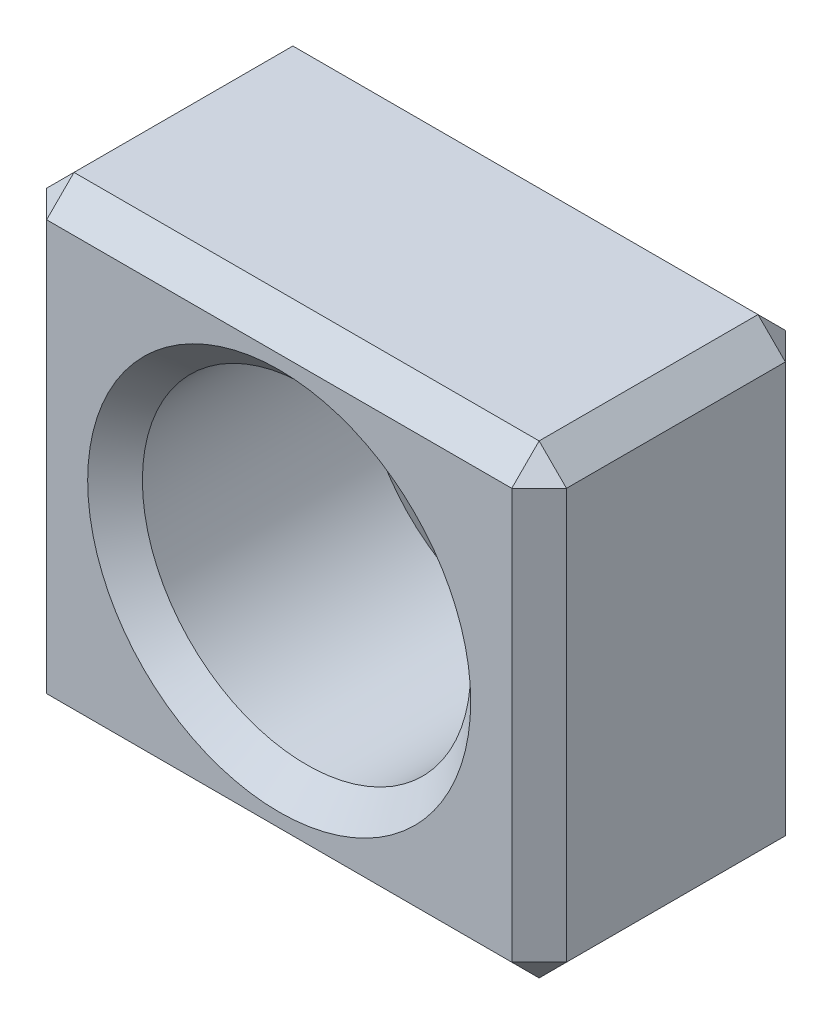
ISO-10303-21;
HEADER;
FILE_DESCRIPTION(('STEP AP214'),'2;1');
FILE_NAME('part.step','',(''),(''),'','','');
FILE_SCHEMA(('AUTOMOTIVE_DESIGN { 1 0 10303 214 1 1 1 1 }'));
ENDSEC;
DATA;
#1=APPLICATION_CONTEXT('core data for automotive mechanical design processes');
#2=APPLICATION_PROTOCOL_DEFINITION('international standard','automotive_design',2000,#1);
#3=PRODUCT_CONTEXT('',#1,'mechanical');
#4=PRODUCT('Part','Part','',(#3));
#5=PRODUCT_RELATED_PRODUCT_CATEGORY('part','',(#4));
#6=PRODUCT_DEFINITION_FORMATION('','',#4);
#7=PRODUCT_DEFINITION_CONTEXT('part definition',#1,'design');
#8=PRODUCT_DEFINITION('design','',#6,#7);
#9=PRODUCT_DEFINITION_SHAPE('','',#8);
#10=(LENGTH_UNIT() NAMED_UNIT(*) SI_UNIT(.MILLI.,.METRE.));
#11=(NAMED_UNIT(*) PLANE_ANGLE_UNIT() SI_UNIT($,.RADIAN.));
#12=(NAMED_UNIT(*) SI_UNIT($,.STERADIAN.) SOLID_ANGLE_UNIT());
#13=UNCERTAINTY_MEASURE_WITH_UNIT(LENGTH_MEASURE(1.E-05),#10,'distance_accuracy_value','');
#14=(GEOMETRIC_REPRESENTATION_CONTEXT(3) GLOBAL_UNCERTAINTY_ASSIGNED_CONTEXT((#13)) GLOBAL_UNIT_ASSIGNED_CONTEXT((#10,
#11,#12)) REPRESENTATION_CONTEXT('',''));
#15=CARTESIAN_POINT('',(0.,0.,0.));
#16=DIRECTION('',(0.,0.,1.));
#17=DIRECTION('',(1.,0.,0.));
#18=AXIS2_PLACEMENT_3D('',#15,#16,#17);
#19=CARTESIAN_POINT('',(8.5,7.5,10.));
#20=DIRECTION('',(-0.577350269189626,-0.577350269189626,-0.577350269189626));
#21=DIRECTION('',(0.,-0.707106781186548,0.707106781186548));
#22=AXIS2_PLACEMENT_3D('',#19,#20,#21);
#23=PLANE('',#22);
#24=DIRECTION('',(-0.707106781186548,0.707106781186548,0.));
#25=VECTOR('',#24,1.);
#26=CARTESIAN_POINT('',(9.,8.,9.));
#27=LINE('',#26,#25);
#28=CARTESIAN_POINT('',(9.5,7.5,9.));
#29=VERTEX_POINT('',#28);
#30=CARTESIAN_POINT('',(8.5,8.5,9.));
#31=VERTEX_POINT('',#30);
#32=EDGE_CURVE('E25',#29,#31,#27,.T.);
#33=ORIENTED_EDGE('',*,*,#32,.T.);
#34=DIRECTION('',(0.,0.707106781186548,-0.707106781186548));
#35=VECTOR('',#34,1.);
#36=CARTESIAN_POINT('',(8.5,7.75,9.75));
#37=LINE('',#36,#35);
#38=CARTESIAN_POINT('',(8.5,7.5,10.));
#39=VERTEX_POINT('',#38);
#40=EDGE_CURVE('E227',#39,#31,#37,.T.);
#41=ORIENTED_EDGE('',*,*,#40,.F.);
#42=DIRECTION('',(0.707106781186548,0.,-0.707106781186548));
#43=VECTOR('',#42,1.);
#44=CARTESIAN_POINT('',(8.75,7.5,9.75));
#45=LINE('',#44,#43);
#46=EDGE_CURVE('E204',#39,#29,#45,.T.);
#47=ORIENTED_EDGE('',*,*,#46,.T.);
#48=EDGE_LOOP('',(#33,#41,#47));
#49=FACE_BOUND('',#48,.T.);
#50=ADVANCED_FACE('F16',(#49),#23,.F.);
#51=CARTESIAN_POINT('',(0.,0.,0.));
#52=DIRECTION('',(0.,0.,-1.));
#53=DIRECTION('',(1.,0.,0.));
#54=AXIS2_PLACEMENT_3D('',#51,#52,#53);
#55=CYLINDRICAL_SURFACE('',#54,6.);
#56=DIRECTION('',(0.,0.,1.));
#57=VECTOR('',#56,1.);
#58=CARTESIAN_POINT('',(6.,0.,0.));
#59=LINE('',#58,#57);
#60=CARTESIAN_POINT('',(6.,0.,1.));
#61=VERTEX_POINT('',#60);
#62=CARTESIAN_POINT('',(6.,0.,9.));
#63=VERTEX_POINT('',#62);
#64=EDGE_CURVE('E10',#61,#63,#59,.T.);
#65=ORIENTED_EDGE('',*,*,#64,.F.);
#66=CARTESIAN_POINT('',(0.,0.,1.));
#67=DIRECTION('',(0.,0.,1.));
#68=DIRECTION('',(1.,0.,0.));
#69=AXIS2_PLACEMENT_3D('',#66,#67,#68);
#70=CIRCLE('',#69,6.);
#71=EDGE_CURVE('E221',#61,#61,#70,.T.);
#72=ORIENTED_EDGE('',*,*,#71,.F.);
#73=ORIENTED_EDGE('',*,*,#64,.T.);
#74=CARTESIAN_POINT('',(0.,0.,9.));
#75=DIRECTION('',(0.,0.,-1.));
#76=DIRECTION('',(1.,0.,0.));
#77=AXIS2_PLACEMENT_3D('',#74,#75,#76);
#78=CIRCLE('',#77,6.);
#79=EDGE_CURVE('E231',#63,#63,#78,.T.);
#80=ORIENTED_EDGE('',*,*,#79,.F.);
#81=EDGE_LOOP('',(#65,#72,#73,#80));
#82=FACE_BOUND('',#81,.T.);
#83=ADVANCED_FACE('F421',(#82),#55,.F.);
#84=CARTESIAN_POINT('',(8.5,7.5,0.));
#85=DIRECTION('',(0.577350269189626,0.577350269189626,-0.577350269189626));
#86=DIRECTION('',(0.,-0.707106781186548,-0.707106781186548));
#87=AXIS2_PLACEMENT_3D('',#84,#85,#86);
#88=PLANE('',#87);
#89=DIRECTION('',(0.707106781186548,0.,0.707106781186548));
#90=VECTOR('',#89,1.);
#91=CARTESIAN_POINT('',(8.75,7.5,0.25));
#92=LINE('',#91,#90);
#93=CARTESIAN_POINT('',(8.5,7.5,0.));
#94=VERTEX_POINT('',#93);
#95=CARTESIAN_POINT('',(9.5,7.5,1.));
#96=VERTEX_POINT('',#95);
#97=EDGE_CURVE('E330',#94,#96,#92,.T.);
#98=ORIENTED_EDGE('',*,*,#97,.F.);
#99=DIRECTION('',(0.,0.707106781186548,0.707106781186548));
#100=VECTOR('',#99,1.);
#101=CARTESIAN_POINT('',(8.5,7.75,0.25));
#102=LINE('',#101,#100);
#103=CARTESIAN_POINT('',(8.5,8.5,1.));
#104=VERTEX_POINT('',#103);
#105=EDGE_CURVE('E334',#94,#104,#102,.T.);
#106=ORIENTED_EDGE('',*,*,#105,.T.);
#107=DIRECTION('',(-0.707106781186548,0.707106781186548,0.));
#108=VECTOR('',#107,1.);
#109=CARTESIAN_POINT('',(9.,8.,1.));
#110=LINE('',#109,#108);
#111=EDGE_CURVE('E361',#96,#104,#110,.T.);
#112=ORIENTED_EDGE('',*,*,#111,.F.);
#113=EDGE_LOOP('',(#98,#106,#112));
#114=FACE_BOUND('',#113,.T.);
#115=ADVANCED_FACE('F425',(#114),#88,.T.);
#116=CARTESIAN_POINT('',(9.5,8.5,0.));
#117=DIRECTION('',(0.,-1.,0.));
#118=DIRECTION('',(0.,0.,-1.));
#119=AXIS2_PLACEMENT_3D('',#116,#117,#118);
#120=PLANE('',#119);
#121=DIRECTION('',(-1.,0.,0.));
#122=VECTOR('',#121,1.);
#123=CARTESIAN_POINT('',(9.5,8.5,9.));
#124=LINE('',#123,#122);
#125=CARTESIAN_POINT('',(-8.5,8.5,9.));
#126=VERTEX_POINT('',#125);
#127=EDGE_CURVE('E206',#31,#126,#124,.T.);
#128=ORIENTED_EDGE('',*,*,#127,.F.);
#129=DIRECTION('',(0.,0.,1.));
#130=VECTOR('',#129,1.);
#131=CARTESIAN_POINT('',(8.5,8.5,0.));
#132=LINE('',#131,#130);
#133=EDGE_CURVE('E123',#104,#31,#132,.T.);
#134=ORIENTED_EDGE('',*,*,#133,.F.);
#135=DIRECTION('',(-1.,0.,0.));
#136=VECTOR('',#135,1.);
#137=CARTESIAN_POINT('',(9.5,8.5,1.));
#138=LINE('',#137,#136);
#139=CARTESIAN_POINT('',(-8.5,8.5,1.));
#140=VERTEX_POINT('',#139);
#141=EDGE_CURVE('E344',#104,#140,#138,.T.);
#142=ORIENTED_EDGE('',*,*,#141,.T.);
#143=DIRECTION('',(0.,0.,1.));
#144=VECTOR('',#143,1.);
#145=CARTESIAN_POINT('',(-8.5,8.5,0.));
#146=LINE('',#145,#144);
#147=EDGE_CURVE('E322',#140,#126,#146,.T.);
#148=ORIENTED_EDGE('',*,*,#147,.T.);
#149=EDGE_LOOP('',(#128,#134,#142,#148));
#150=FACE_BOUND('',#149,.T.);
#151=ADVANCED_FACE('F374',(#150),#120,.F.);
#152=CARTESIAN_POINT('',(-8.5,7.5,10.));
#153=DIRECTION('',(-0.577350269189626,0.577350269189626,0.577350269189626));
#154=DIRECTION('',(0.707106781186548,0.,0.707106781186548));
#155=AXIS2_PLACEMENT_3D('',#152,#153,#154);
#156=PLANE('',#155);
#157=DIRECTION('',(-0.707106781186548,0.,-0.707106781186548));
#158=VECTOR('',#157,1.);
#159=CARTESIAN_POINT('',(-8.75,7.5,9.75));
#160=LINE('',#159,#158);
#161=CARTESIAN_POINT('',(-8.5,7.5,10.));
#162=VERTEX_POINT('',#161);
#163=CARTESIAN_POINT('',(-9.5,7.5,9.));
#164=VERTEX_POINT('',#163);
#165=EDGE_CURVE('E317',#162,#164,#160,.T.);
#166=ORIENTED_EDGE('',*,*,#165,.F.);
#167=DIRECTION('',(0.,0.707106781186548,-0.707106781186548));
#168=VECTOR('',#167,1.);
#169=CARTESIAN_POINT('',(-8.5,7.75,9.75));
#170=LINE('',#169,#168);
#171=EDGE_CURVE('E232',#162,#126,#170,.T.);
#172=ORIENTED_EDGE('',*,*,#171,.T.);
#173=DIRECTION('',(0.707106781186548,0.707106781186548,0.));
#174=VECTOR('',#173,1.);
#175=CARTESIAN_POINT('',(-9.,8.,9.));
#176=LINE('',#175,#174);
#177=EDGE_CURVE('E318',#164,#126,#176,.T.);
#178=ORIENTED_EDGE('',*,*,#177,.F.);
#179=EDGE_LOOP('',(#166,#172,#178));
#180=FACE_BOUND('',#179,.T.);
#181=ADVANCED_FACE('F383',(#180),#156,.T.);
#182=CARTESIAN_POINT('',(-8.5,7.5,0.));
#183=DIRECTION('',(0.577350269189626,-0.577350269189626,0.577350269189626));
#184=DIRECTION('',(0.,-0.707106781186548,-0.707106781186548));
#185=AXIS2_PLACEMENT_3D('',#182,#183,#184);
#186=PLANE('',#185);
#187=DIRECTION('',(0.707106781186548,0.707106781186548,0.));
#188=VECTOR('',#187,1.);
#189=CARTESIAN_POINT('',(-9.,8.,1.));
#190=LINE('',#189,#188);
#191=CARTESIAN_POINT('',(-9.5,7.5,1.));
#192=VERTEX_POINT('',#191);
#193=EDGE_CURVE('E326',#192,#140,#190,.T.);
#194=ORIENTED_EDGE('',*,*,#193,.T.);
#195=DIRECTION('',(0.,0.707106781186548,0.707106781186548));
#196=VECTOR('',#195,1.);
#197=CARTESIAN_POINT('',(-8.5,7.75,0.25));
#198=LINE('',#197,#196);
#199=CARTESIAN_POINT('',(-8.5,7.5,0.));
#200=VERTEX_POINT('',#199);
#201=EDGE_CURVE('E338',#200,#140,#198,.T.);
#202=ORIENTED_EDGE('',*,*,#201,.F.);
#203=DIRECTION('',(-0.707106781186548,0.,0.707106781186548));
#204=VECTOR('',#203,1.);
#205=CARTESIAN_POINT('',(-8.75,7.5,0.25));
#206=LINE('',#205,#204);
#207=EDGE_CURVE('E285',#200,#192,#206,.T.);
#208=ORIENTED_EDGE('',*,*,#207,.T.);
#209=EDGE_LOOP('',(#194,#202,#208));
#210=FACE_BOUND('',#209,.T.);
#211=ADVANCED_FACE('F453',(#210),#186,.F.);
#212=CARTESIAN_POINT('',(9.,8.,0.));
#213=DIRECTION('',(0.707106781186548,0.707106781186548,0.));
#214=DIRECTION('',(0.,0.,-1.));
#215=AXIS2_PLACEMENT_3D('',#212,#213,#214);
#216=PLANE('',#215);
#217=ORIENTED_EDGE('',*,*,#111,.T.);
#218=ORIENTED_EDGE('',*,*,#133,.T.);
#219=ORIENTED_EDGE('',*,*,#32,.F.);
#220=DIRECTION('',(0.,0.,1.));
#221=VECTOR('',#220,1.);
#222=CARTESIAN_POINT('',(9.5,7.5,0.));
#223=LINE('',#222,#221);
#224=EDGE_CURVE('E286',#96,#29,#223,.T.);
#225=ORIENTED_EDGE('',*,*,#224,.F.);
#226=EDGE_LOOP('',(#217,#218,#219,#225));
#227=FACE_BOUND('',#226,.T.);
#228=ADVANCED_FACE('F366',(#227),#216,.T.);
#229=CARTESIAN_POINT('',(0.,0.,9.));
#230=DIRECTION('',(0.,0.,1.));
#231=DIRECTION('',(1.,0.,0.));
#232=AXIS2_PLACEMENT_3D('',#229,#230,#231);
#233=CONICAL_SURFACE('',#232,6.,0.785398163397);
#234=ORIENTED_EDGE('',*,*,#79,.T.);
#235=DIRECTION('',(-0.707106781186548,0.,-0.707106781186548));
#236=VECTOR('',#235,1.);
#237=CARTESIAN_POINT('',(6.,0.,9.));
#238=LINE('',#237,#236);
#239=CARTESIAN_POINT('',(7.,0.,10.));
#240=VERTEX_POINT('',#239);
#241=EDGE_CURVE('E358',#240,#63,#238,.T.);
#242=ORIENTED_EDGE('',*,*,#241,.F.);
#243=CARTESIAN_POINT('',(0.,0.,10.));
#244=DIRECTION('',(0.,0.,-1.));
#245=DIRECTION('',(1.,0.,0.));
#246=AXIS2_PLACEMENT_3D('',#243,#244,#245);
#247=CIRCLE('',#246,7.);
#248=EDGE_CURVE('E304',#240,#240,#247,.T.);
#249=ORIENTED_EDGE('',*,*,#248,.F.);
#250=ORIENTED_EDGE('',*,*,#241,.T.);
#251=EDGE_LOOP('',(#234,#242,#249,#250));
#252=FACE_BOUND('',#251,.T.);
#253=ADVANCED_FACE('F459',(#252),#233,.F.);
#254=CARTESIAN_POINT('',(9.5,8.,9.5));
#255=DIRECTION('',(0.,-0.707106781186548,-0.707106781186548));
#256=DIRECTION('',(0.,-0.707106781186548,0.707106781186548));
#257=AXIS2_PLACEMENT_3D('',#254,#255,#256);
#258=PLANE('',#257);
#259=ORIENTED_EDGE('',*,*,#127,.T.);
#260=ORIENTED_EDGE('',*,*,#171,.F.);
#261=DIRECTION('',(-1.,0.,0.));
#262=VECTOR('',#261,1.);
#263=CARTESIAN_POINT('',(9.5,7.5,10.));
#264=LINE('',#263,#262);
#265=EDGE_CURVE('E294',#39,#162,#264,.T.);
#266=ORIENTED_EDGE('',*,*,#265,.F.);
#267=ORIENTED_EDGE('',*,*,#40,.T.);
#268=EDGE_LOOP('',(#259,#260,#266,#267));
#269=FACE_BOUND('',#268,.T.);
#270=ADVANCED_FACE('F371',(#269),#258,.F.);
#271=CARTESIAN_POINT('',(9.,-8.5,9.5));
#272=DIRECTION('',(-0.707106781186548,0.,-0.707106781186548));
#273=DIRECTION('',(-0.707106781186548,0.,0.707106781186548));
#274=AXIS2_PLACEMENT_3D('',#271,#272,#273);
#275=PLANE('',#274);
#276=DIRECTION('',(0.707106781186548,0.,-0.707106781186548));
#277=VECTOR('',#276,1.);
#278=CARTESIAN_POINT('',(8.75,-7.5,9.75));
#279=LINE('',#278,#277);
#280=CARTESIAN_POINT('',(8.5,-7.5,10.));
#281=VERTEX_POINT('',#280);
#282=CARTESIAN_POINT('',(9.5,-7.5,9.));
#283=VERTEX_POINT('',#282);
#284=EDGE_CURVE('E299',#281,#283,#279,.T.);
#285=ORIENTED_EDGE('',*,*,#284,.T.);
#286=DIRECTION('',(0.,1.,0.));
#287=VECTOR('',#286,1.);
#288=CARTESIAN_POINT('',(9.5,-8.5,9.));
#289=LINE('',#288,#287);
#290=EDGE_CURVE('E281',#283,#29,#289,.T.);
#291=ORIENTED_EDGE('',*,*,#290,.T.);
#292=ORIENTED_EDGE('',*,*,#46,.F.);
#293=DIRECTION('',(0.,1.,0.));
#294=VECTOR('',#293,1.);
#295=CARTESIAN_POINT('',(8.5,-8.5,10.));
#296=LINE('',#295,#294);
#297=EDGE_CURVE('E290',#281,#39,#296,.T.);
#298=ORIENTED_EDGE('',*,*,#297,.F.);
#299=EDGE_LOOP('',(#285,#291,#292,#298));
#300=FACE_BOUND('',#299,.T.);
#301=ADVANCED_FACE('F428',(#300),#275,.F.);
#302=CARTESIAN_POINT('',(0.,0.,1.));
#303=DIRECTION('',(0.,0.,-1.));
#304=DIRECTION('',(1.,0.,0.));
#305=AXIS2_PLACEMENT_3D('',#302,#303,#304);
#306=CONICAL_SURFACE('',#305,6.,0.785398163397);
#307=ORIENTED_EDGE('',*,*,#71,.T.);
#308=DIRECTION('',(-0.707106781186548,0.,0.707106781186548));
#309=VECTOR('',#308,1.);
#310=CARTESIAN_POINT('',(6.,0.,1.));
#311=LINE('',#310,#309);
#312=CARTESIAN_POINT('',(7.,0.,0.));
#313=VERTEX_POINT('',#312);
#314=EDGE_CURVE('E207',#313,#61,#311,.T.);
#315=ORIENTED_EDGE('',*,*,#314,.F.);
#316=CARTESIAN_POINT('',(0.,0.,0.));
#317=DIRECTION('',(0.,0.,1.));
#318=DIRECTION('',(1.,0.,0.));
#319=AXIS2_PLACEMENT_3D('',#316,#317,#318);
#320=CIRCLE('',#319,7.);
#321=EDGE_CURVE('E276',#313,#313,#320,.T.);
#322=ORIENTED_EDGE('',*,*,#321,.F.);
#323=ORIENTED_EDGE('',*,*,#314,.T.);
#324=EDGE_LOOP('',(#307,#315,#322,#323));
#325=FACE_BOUND('',#324,.T.);
#326=ADVANCED_FACE('F467',(#325),#306,.F.);
#327=CARTESIAN_POINT('',(9.5,8.,0.5));
#328=DIRECTION('',(0.,0.707106781186548,-0.707106781186548));
#329=DIRECTION('',(-1.,0.,0.));
#330=AXIS2_PLACEMENT_3D('',#327,#328,#329);
#331=PLANE('',#330);
#332=ORIENTED_EDGE('',*,*,#105,.F.);
#333=DIRECTION('',(-1.,0.,0.));
#334=VECTOR('',#333,1.);
#335=CARTESIAN_POINT('',(9.5,7.5,0.));
#336=LINE('',#335,#334);
#337=EDGE_CURVE('E266',#94,#200,#336,.T.);
#338=ORIENTED_EDGE('',*,*,#337,.T.);
#339=ORIENTED_EDGE('',*,*,#201,.T.);
#340=ORIENTED_EDGE('',*,*,#141,.F.);
#341=EDGE_LOOP('',(#332,#338,#339,#340));
#342=FACE_BOUND('',#341,.T.);
#343=ADVANCED_FACE('F442',(#342),#331,.T.);
#344=CARTESIAN_POINT('',(9.,-8.5,0.5));
#345=DIRECTION('',(0.707106781186548,0.,-0.707106781186548));
#346=DIRECTION('',(0.,-1.,0.));
#347=AXIS2_PLACEMENT_3D('',#344,#345,#346);
#348=PLANE('',#347);
#349=DIRECTION('',(0.,1.,0.));
#350=VECTOR('',#349,1.);
#351=CARTESIAN_POINT('',(8.5,-8.5,0.));
#352=LINE('',#351,#350);
#353=CARTESIAN_POINT('',(8.5,-7.5,0.));
#354=VERTEX_POINT('',#353);
#355=EDGE_CURVE('E270',#354,#94,#352,.T.);
#356=ORIENTED_EDGE('',*,*,#355,.T.);
#357=ORIENTED_EDGE('',*,*,#97,.T.);
#358=DIRECTION('',(0.,1.,0.));
#359=VECTOR('',#358,1.);
#360=CARTESIAN_POINT('',(9.5,-8.5,1.));
#361=LINE('',#360,#359);
#362=CARTESIAN_POINT('',(9.5,-7.5,1.));
#363=VERTEX_POINT('',#362);
#364=EDGE_CURVE('E303',#363,#96,#361,.T.);
#365=ORIENTED_EDGE('',*,*,#364,.F.);
#366=DIRECTION('',(0.707106781186548,0.,0.707106781186548));
#367=VECTOR('',#366,1.);
#368=CARTESIAN_POINT('',(8.75,-7.5,0.25));
#369=LINE('',#368,#367);
#370=EDGE_CURVE('E280',#354,#363,#369,.T.);
#371=ORIENTED_EDGE('',*,*,#370,.F.);
#372=EDGE_LOOP('',(#356,#357,#365,#371));
#373=FACE_BOUND('',#372,.T.);
#374=ADVANCED_FACE('F433',(#373),#348,.T.);
#375=CARTESIAN_POINT('',(-9.,8.,0.));
#376=DIRECTION('',(-0.707106781186548,0.707106781186548,0.));
#377=DIRECTION('',(0.,0.,1.));
#378=AXIS2_PLACEMENT_3D('',#375,#376,#377);
#379=PLANE('',#378);
#380=DIRECTION('',(0.,0.,1.));
#381=VECTOR('',#380,1.);
#382=CARTESIAN_POINT('',(-9.5,7.5,0.));
#383=LINE('',#382,#381);
#384=EDGE_CURVE('E258',#192,#164,#383,.T.);
#385=ORIENTED_EDGE('',*,*,#384,.T.);
#386=ORIENTED_EDGE('',*,*,#177,.T.);
#387=ORIENTED_EDGE('',*,*,#147,.F.);
#388=ORIENTED_EDGE('',*,*,#193,.F.);
#389=EDGE_LOOP('',(#385,#386,#387,#388));
#390=FACE_BOUND('',#389,.T.);
#391=ADVANCED_FACE('F377',(#390),#379,.T.);
#392=CARTESIAN_POINT('',(-9.,8.5,9.5));
#393=DIRECTION('',(0.707106781186548,0.,-0.707106781186548));
#394=DIRECTION('',(0.,-1.,0.));
#395=AXIS2_PLACEMENT_3D('',#392,#393,#394);
#396=PLANE('',#395);
#397=ORIENTED_EDGE('',*,*,#165,.T.);
#398=DIRECTION('',(0.,-1.,0.));
#399=VECTOR('',#398,1.);
#400=CARTESIAN_POINT('',(-9.5,8.5,9.));
#401=LINE('',#400,#399);
#402=CARTESIAN_POINT('',(-9.5,-7.5,9.));
#403=VERTEX_POINT('',#402);
#404=EDGE_CURVE('E254',#164,#403,#401,.T.);
#405=ORIENTED_EDGE('',*,*,#404,.T.);
#406=DIRECTION('',(-0.707106781186548,0.,-0.707106781186548));
#407=VECTOR('',#406,1.);
#408=CARTESIAN_POINT('',(-8.75,-7.5,9.75));
#409=LINE('',#408,#407);
#410=CARTESIAN_POINT('',(-8.5,-7.5,10.));
#411=VERTEX_POINT('',#410);
#412=EDGE_CURVE('E250',#411,#403,#409,.T.);
#413=ORIENTED_EDGE('',*,*,#412,.F.);
#414=DIRECTION('',(0.,-1.,0.));
#415=VECTOR('',#414,1.);
#416=CARTESIAN_POINT('',(-8.5,8.5,10.));
#417=LINE('',#416,#415);
#418=EDGE_CURVE('E298',#162,#411,#417,.T.);
#419=ORIENTED_EDGE('',*,*,#418,.F.);
#420=EDGE_LOOP('',(#397,#405,#413,#419));
#421=FACE_BOUND('',#420,.T.);
#422=ADVANCED_FACE('F386',(#421),#396,.F.);
#423=CARTESIAN_POINT('',(-9.,8.5,0.5));
#424=DIRECTION('',(-0.707106781186548,0.,-0.707106781186548));
#425=DIRECTION('',(-0.707106781186548,0.,0.707106781186548));
#426=AXIS2_PLACEMENT_3D('',#423,#424,#425);
#427=PLANE('',#426);
#428=DIRECTION('',(0.,-1.,0.));
#429=VECTOR('',#428,1.);
#430=CARTESIAN_POINT('',(-8.5,8.5,0.));
#431=LINE('',#430,#429);
#432=CARTESIAN_POINT('',(-8.5,-7.5,0.));
#433=VERTEX_POINT('',#432);
#434=EDGE_CURVE('E265',#200,#433,#431,.T.);
#435=ORIENTED_EDGE('',*,*,#434,.T.);
#436=DIRECTION('',(-0.707106781186548,0.,0.707106781186548));
#437=VECTOR('',#436,1.);
#438=CARTESIAN_POINT('',(-8.75,-7.5,0.25));
#439=LINE('',#438,#437);
#440=CARTESIAN_POINT('',(-9.5,-7.5,1.));
#441=VERTEX_POINT('',#440);
#442=EDGE_CURVE('E158',#433,#441,#439,.T.);
#443=ORIENTED_EDGE('',*,*,#442,.T.);
#444=DIRECTION('',(0.,-1.,0.));
#445=VECTOR('',#444,1.);
#446=CARTESIAN_POINT('',(-9.5,8.5,1.));
#447=LINE('',#446,#445);
#448=EDGE_CURVE('E262',#192,#441,#447,.T.);
#449=ORIENTED_EDGE('',*,*,#448,.F.);
#450=ORIENTED_EDGE('',*,*,#207,.F.);
#451=EDGE_LOOP('',(#435,#443,#449,#450));
#452=FACE_BOUND('',#451,.T.);
#453=ADVANCED_FACE('F478',(#452),#427,.T.);
#454=CARTESIAN_POINT('',(9.5,-8.5,0.));
#455=DIRECTION('',(-1.,0.,0.));
#456=DIRECTION('',(0.,0.,1.));
#457=AXIS2_PLACEMENT_3D('',#454,#455,#456);
#458=PLANE('',#457);
#459=ORIENTED_EDGE('',*,*,#364,.T.);
#460=ORIENTED_EDGE('',*,*,#224,.T.);
#461=ORIENTED_EDGE('',*,*,#290,.F.);
#462=DIRECTION('',(0.,0.,1.));
#463=VECTOR('',#462,1.);
#464=CARTESIAN_POINT('',(9.5,-7.5,0.));
#465=LINE('',#464,#463);
#466=EDGE_CURVE('E235',#363,#283,#465,.T.);
#467=ORIENTED_EDGE('',*,*,#466,.F.);
#468=EDGE_LOOP('',(#459,#460,#461,#467));
#469=FACE_BOUND('',#468,.T.);
#470=ADVANCED_FACE('F431',(#469),#458,.F.);
#471=CARTESIAN_POINT('',(8.5,-7.5,10.));
#472=DIRECTION('',(-0.577350269189626,0.577350269189626,-0.577350269189626));
#473=DIRECTION('',(-0.707106781186548,0.,0.707106781186548));
#474=AXIS2_PLACEMENT_3D('',#471,#472,#473);
#475=PLANE('',#474);
#476=DIRECTION('',(0.707106781186548,0.707106781186548,0.));
#477=VECTOR('',#476,1.);
#478=CARTESIAN_POINT('',(9.,-8.,9.));
#479=LINE('',#478,#477);
#480=CARTESIAN_POINT('',(8.5,-8.5,9.));
#481=VERTEX_POINT('',#480);
#482=EDGE_CURVE('E239',#481,#283,#479,.T.);
#483=ORIENTED_EDGE('',*,*,#482,.T.);
#484=ORIENTED_EDGE('',*,*,#284,.F.);
#485=DIRECTION('',(0.,-0.707106781186548,-0.707106781186548));
#486=VECTOR('',#485,1.);
#487=CARTESIAN_POINT('',(8.5,-7.75,9.75));
#488=LINE('',#487,#486);
#489=EDGE_CURVE('E214',#281,#481,#488,.T.);
#490=ORIENTED_EDGE('',*,*,#489,.T.);
#491=EDGE_LOOP('',(#483,#484,#490));
#492=FACE_BOUND('',#491,.T.);
#493=ADVANCED_FACE('F477',(#492),#475,.F.);
#494=CARTESIAN_POINT('',(0.,0.,10.));
#495=DIRECTION('',(0.,0.,1.));
#496=DIRECTION('',(1.,0.,0.));
#497=AXIS2_PLACEMENT_3D('',#494,#495,#496);
#498=PLANE('',#497);
#499=ORIENTED_EDGE('',*,*,#248,.T.);
#500=EDGE_LOOP('',(#499));
#501=FACE_BOUND('',#500,.T.);
#502=DIRECTION('',(1.,0.,0.));
#503=VECTOR('',#502,1.);
#504=CARTESIAN_POINT('',(-9.5,-7.5,10.));
#505=LINE('',#504,#503);
#506=EDGE_CURVE('E209',#411,#281,#505,.T.);
#507=ORIENTED_EDGE('',*,*,#506,.T.);
#508=ORIENTED_EDGE('',*,*,#297,.T.);
#509=ORIENTED_EDGE('',*,*,#265,.T.);
#510=ORIENTED_EDGE('',*,*,#418,.T.);
#511=EDGE_LOOP('',(#507,#508,#509,#510));
#512=FACE_BOUND('',#511,.T.);
#513=ADVANCED_FACE('F394',(#501,#512),#498,.T.);
#514=CARTESIAN_POINT('',(8.5,-7.5,0.));
#515=DIRECTION('',(0.577350269189626,-0.577350269189626,-0.577350269189626));
#516=DIRECTION('',(0.,-0.707106781186548,0.707106781186548));
#517=AXIS2_PLACEMENT_3D('',#514,#515,#516);
#518=PLANE('',#517);
#519=DIRECTION('',(0.,-0.707106781186548,0.707106781186548));
#520=VECTOR('',#519,1.);
#521=CARTESIAN_POINT('',(8.5,-7.75,0.25));
#522=LINE('',#521,#520);
#523=CARTESIAN_POINT('',(8.5,-8.5,1.));
#524=VERTEX_POINT('',#523);
#525=EDGE_CURVE('E165',#354,#524,#522,.T.);
#526=ORIENTED_EDGE('',*,*,#525,.F.);
#527=ORIENTED_EDGE('',*,*,#370,.T.);
#528=DIRECTION('',(0.707106781186548,0.707106781186548,0.));
#529=VECTOR('',#528,1.);
#530=CARTESIAN_POINT('',(9.,-8.,1.));
#531=LINE('',#530,#529);
#532=EDGE_CURVE('E213',#524,#363,#531,.T.);
#533=ORIENTED_EDGE('',*,*,#532,.F.);
#534=EDGE_LOOP('',(#526,#527,#533));
#535=FACE_BOUND('',#534,.T.);
#536=ADVANCED_FACE('F437',(#535),#518,.T.);
#537=CARTESIAN_POINT('',(0.,0.,0.));
#538=DIRECTION('',(0.,0.,1.));
#539=DIRECTION('',(1.,0.,0.));
#540=AXIS2_PLACEMENT_3D('',#537,#538,#539);
#541=PLANE('',#540);
#542=ORIENTED_EDGE('',*,*,#321,.T.);
#543=EDGE_LOOP('',(#542));
#544=FACE_BOUND('',#543,.T.);
#545=ORIENTED_EDGE('',*,*,#434,.F.);
#546=ORIENTED_EDGE('',*,*,#337,.F.);
#547=ORIENTED_EDGE('',*,*,#355,.F.);
#548=DIRECTION('',(1.,0.,0.));
#549=VECTOR('',#548,1.);
#550=CARTESIAN_POINT('',(-9.5,-7.5,0.));
#551=LINE('',#550,#549);
#552=EDGE_CURVE('E177',#433,#354,#551,.T.);
#553=ORIENTED_EDGE('',*,*,#552,.F.);
#554=EDGE_LOOP('',(#545,#546,#547,#553));
#555=FACE_BOUND('',#554,.T.);
#556=ADVANCED_FACE('F416',(#544,#555),#541,.F.);
#557=CARTESIAN_POINT('',(-9.5,8.5,0.));
#558=DIRECTION('',(1.,0.,0.));
#559=DIRECTION('',(0.,1.,0.));
#560=AXIS2_PLACEMENT_3D('',#557,#558,#559);
#561=PLANE('',#560);
#562=ORIENTED_EDGE('',*,*,#404,.F.);
#563=ORIENTED_EDGE('',*,*,#384,.F.);
#564=ORIENTED_EDGE('',*,*,#448,.T.);
#565=DIRECTION('',(0.,0.,1.));
#566=VECTOR('',#565,1.);
#567=CARTESIAN_POINT('',(-9.5,-7.5,0.));
#568=LINE('',#567,#566);
#569=EDGE_CURVE('E175',#441,#403,#568,.T.);
#570=ORIENTED_EDGE('',*,*,#569,.T.);
#571=EDGE_LOOP('',(#562,#563,#564,#570));
#572=FACE_BOUND('',#571,.T.);
#573=ADVANCED_FACE('F407',(#572),#561,.F.);
#574=CARTESIAN_POINT('',(-8.5,-7.5,10.));
#575=DIRECTION('',(-0.577350269189626,-0.577350269189626,0.577350269189626));
#576=DIRECTION('',(-0.707106781186548,0.707106781186548,0.));
#577=AXIS2_PLACEMENT_3D('',#574,#575,#576);
#578=PLANE('',#577);
#579=DIRECTION('',(0.,-0.707106781186548,-0.707106781186548));
#580=VECTOR('',#579,1.);
#581=CARTESIAN_POINT('',(-8.5,-7.75,9.75));
#582=LINE('',#581,#580);
#583=CARTESIAN_POINT('',(-8.5,-8.5,9.));
#584=VERTEX_POINT('',#583);
#585=EDGE_CURVE('E164',#411,#584,#582,.T.);
#586=ORIENTED_EDGE('',*,*,#585,.F.);
#587=ORIENTED_EDGE('',*,*,#412,.T.);
#588=DIRECTION('',(-0.707106781186548,0.707106781186548,0.));
#589=VECTOR('',#588,1.);
#590=CARTESIAN_POINT('',(-9.,-8.,9.));
#591=LINE('',#590,#589);
#592=EDGE_CURVE('E187',#584,#403,#591,.T.);
#593=ORIENTED_EDGE('',*,*,#592,.F.);
#594=EDGE_LOOP('',(#586,#587,#593));
#595=FACE_BOUND('',#594,.T.);
#596=ADVANCED_FACE('F402',(#595),#578,.T.);
#597=CARTESIAN_POINT('',(-8.5,-7.5,0.));
#598=DIRECTION('',(0.577350269189626,0.577350269189626,0.577350269189626));
#599=DIRECTION('',(0.,0.707106781186548,-0.707106781186548));
#600=AXIS2_PLACEMENT_3D('',#597,#598,#599);
#601=PLANE('',#600);
#602=DIRECTION('',(-0.707106781186548,0.707106781186548,0.));
#603=VECTOR('',#602,1.);
#604=CARTESIAN_POINT('',(-9.,-8.,1.));
#605=LINE('',#604,#603);
#606=CARTESIAN_POINT('',(-8.5,-8.5,1.));
#607=VERTEX_POINT('',#606);
#608=EDGE_CURVE('E155',#607,#441,#605,.T.);
#609=ORIENTED_EDGE('',*,*,#608,.T.);
#610=ORIENTED_EDGE('',*,*,#442,.F.);
#611=DIRECTION('',(0.,-0.707106781186548,0.707106781186548));
#612=VECTOR('',#611,1.);
#613=CARTESIAN_POINT('',(-8.5,-7.75,0.25));
#614=LINE('',#613,#612);
#615=EDGE_CURVE('E152',#433,#607,#614,.T.);
#616=ORIENTED_EDGE('',*,*,#615,.T.);
#617=EDGE_LOOP('',(#609,#610,#616));
#618=FACE_BOUND('',#617,.T.);
#619=ADVANCED_FACE('F154',(#618),#601,.F.);
#620=CARTESIAN_POINT('',(9.,-8.,0.));
#621=DIRECTION('',(0.707106781186548,-0.707106781186548,0.));
#622=DIRECTION('',(0.,0.,-1.));
#623=AXIS2_PLACEMENT_3D('',#620,#621,#622);
#624=PLANE('',#623);
#625=ORIENTED_EDGE('',*,*,#532,.T.);
#626=ORIENTED_EDGE('',*,*,#466,.T.);
#627=ORIENTED_EDGE('',*,*,#482,.F.);
#628=DIRECTION('',(0.,0.,1.));
#629=VECTOR('',#628,1.);
#630=CARTESIAN_POINT('',(8.5,-8.5,0.));
#631=LINE('',#630,#629);
#632=EDGE_CURVE('E194',#524,#481,#631,.T.);
#633=ORIENTED_EDGE('',*,*,#632,.F.);
#634=EDGE_LOOP('',(#625,#626,#627,#633));
#635=FACE_BOUND('',#634,.T.);
#636=ADVANCED_FACE('F414',(#635),#624,.T.);
#637=CARTESIAN_POINT('',(-9.5,-8.,9.5));
#638=DIRECTION('',(0.,0.707106781186548,-0.707106781186548));
#639=DIRECTION('',(-1.,0.,0.));
#640=AXIS2_PLACEMENT_3D('',#637,#638,#639);
#641=PLANE('',#640);
#642=ORIENTED_EDGE('',*,*,#585,.T.);
#643=DIRECTION('',(1.,0.,0.));
#644=VECTOR('',#643,1.);
#645=CARTESIAN_POINT('',(-9.5,-8.5,9.));
#646=LINE('',#645,#644);
#647=EDGE_CURVE('E185',#584,#481,#646,.T.);
#648=ORIENTED_EDGE('',*,*,#647,.T.);
#649=ORIENTED_EDGE('',*,*,#489,.F.);
#650=ORIENTED_EDGE('',*,*,#506,.F.);
#651=EDGE_LOOP('',(#642,#648,#649,#650));
#652=FACE_BOUND('',#651,.T.);
#653=ADVANCED_FACE('F401',(#652),#641,.F.);
#654=CARTESIAN_POINT('',(-9.5,-8.,0.5));
#655=DIRECTION('',(0.,-0.707106781186548,-0.707106781186548));
#656=DIRECTION('',(0.,-0.707106781186548,0.707106781186548));
#657=AXIS2_PLACEMENT_3D('',#654,#655,#656);
#658=PLANE('',#657);
#659=ORIENTED_EDGE('',*,*,#552,.T.);
#660=ORIENTED_EDGE('',*,*,#525,.T.);
#661=DIRECTION('',(1.,0.,0.));
#662=VECTOR('',#661,1.);
#663=CARTESIAN_POINT('',(-9.5,-8.5,1.));
#664=LINE('',#663,#662);
#665=EDGE_CURVE('E183',#607,#524,#664,.T.);
#666=ORIENTED_EDGE('',*,*,#665,.F.);
#667=ORIENTED_EDGE('',*,*,#615,.F.);
#668=EDGE_LOOP('',(#659,#660,#666,#667));
#669=FACE_BOUND('',#668,.T.);
#670=ADVANCED_FACE('F190',(#669),#658,.T.);
#671=CARTESIAN_POINT('',(-9.,-8.,0.));
#672=DIRECTION('',(-0.707106781186548,-0.707106781186548,0.));
#673=DIRECTION('',(-0.707106781186548,0.707106781186548,0.));
#674=AXIS2_PLACEMENT_3D('',#671,#672,#673);
#675=PLANE('',#674);
#676=DIRECTION('',(0.,0.,1.));
#677=VECTOR('',#676,1.);
#678=CARTESIAN_POINT('',(-8.5,-8.5,0.));
#679=LINE('',#678,#677);
#680=EDGE_CURVE('E172',#607,#584,#679,.T.);
#681=ORIENTED_EDGE('',*,*,#680,.T.);
#682=ORIENTED_EDGE('',*,*,#592,.T.);
#683=ORIENTED_EDGE('',*,*,#569,.F.);
#684=ORIENTED_EDGE('',*,*,#608,.F.);
#685=EDGE_LOOP('',(#681,#682,#683,#684));
#686=FACE_BOUND('',#685,.T.);
#687=ADVANCED_FACE('F170',(#686),#675,.T.);
#688=CARTESIAN_POINT('',(-9.5,-8.5,0.));
#689=DIRECTION('',(0.,1.,0.));
#690=DIRECTION('',(1.,0.,0.));
#691=AXIS2_PLACEMENT_3D('',#688,#689,#690);
#692=PLANE('',#691);
#693=ORIENTED_EDGE('',*,*,#665,.T.);
#694=ORIENTED_EDGE('',*,*,#632,.T.);
#695=ORIENTED_EDGE('',*,*,#647,.F.);
#696=ORIENTED_EDGE('',*,*,#680,.F.);
#697=EDGE_LOOP('',(#693,#694,#695,#696));
#698=FACE_BOUND('',#697,.T.);
#699=ADVANCED_FACE('F181',(#698),#692,.F.);
#700=CLOSED_SHELL('',(#50,#83,#115,#151,#181,#211,#228,#253,#270,#301,#326,#343,#374,#391,#422,
#453,#470,#493,#513,#536,#556,#573,#596,#619,#636,#653,#670,#687,#699));
#701=MANIFOLD_SOLID_BREP('B1',#700);
#702=ADVANCED_BREP_SHAPE_REPRESENTATION('',(#18,#701),#14);
#703=SHAPE_DEFINITION_REPRESENTATION(#9,#702);
ENDSEC;
END-ISO-10303-21;
